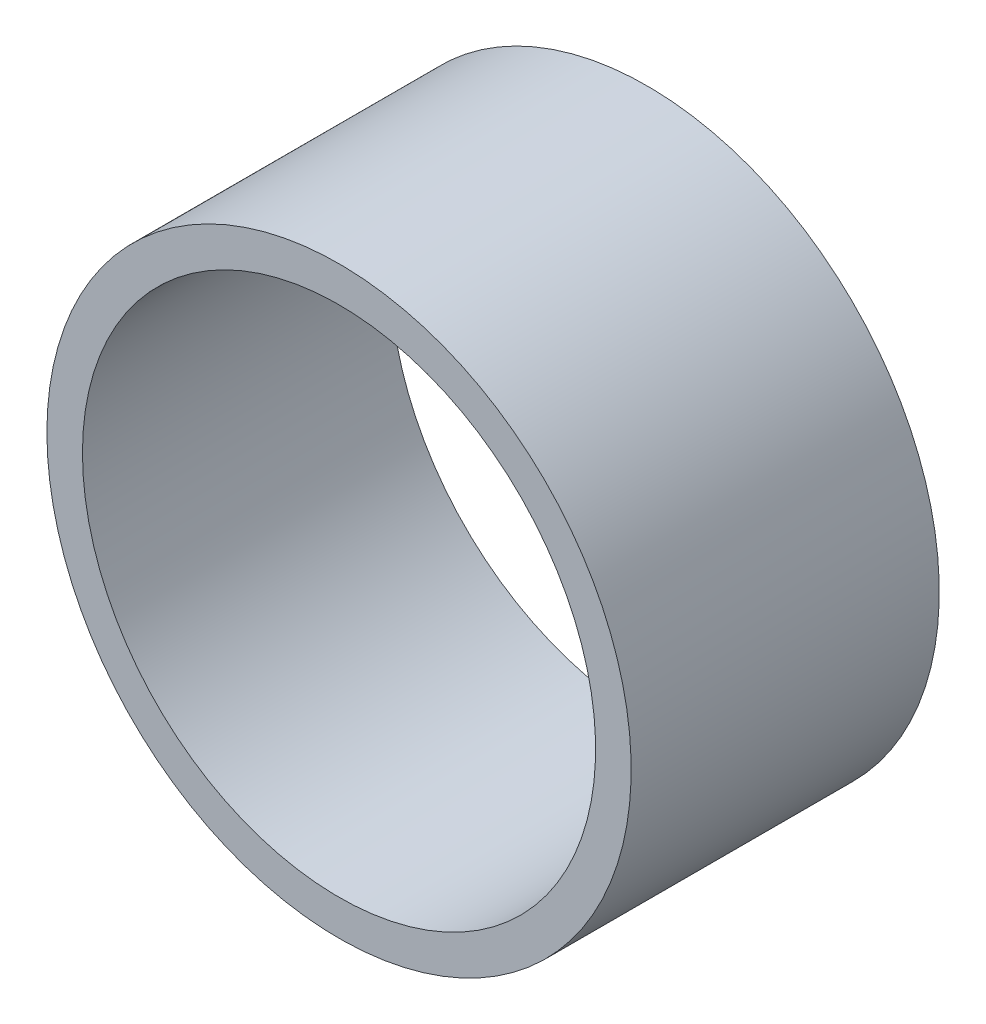
ISO-10303-21;
HEADER;
FILE_DESCRIPTION(('STEP AP214'),'2;1');
FILE_NAME('part.step','',(''),(''),'','','');
FILE_SCHEMA(('AUTOMOTIVE_DESIGN { 1 0 10303 214 1 1 1 1 }'));
ENDSEC;
DATA;
#1=APPLICATION_CONTEXT('core data for automotive mechanical design processes');
#2=APPLICATION_PROTOCOL_DEFINITION('international standard','automotive_design',2000,#1);
#3=PRODUCT_CONTEXT('',#1,'mechanical');
#4=PRODUCT('Part','Part','',(#3));
#5=PRODUCT_RELATED_PRODUCT_CATEGORY('part','',(#4));
#6=PRODUCT_DEFINITION_FORMATION('','',#4);
#7=PRODUCT_DEFINITION_CONTEXT('part definition',#1,'design');
#8=PRODUCT_DEFINITION('design','',#6,#7);
#9=PRODUCT_DEFINITION_SHAPE('','',#8);
#10=(LENGTH_UNIT() NAMED_UNIT(*) SI_UNIT(.MILLI.,.METRE.));
#11=(NAMED_UNIT(*) PLANE_ANGLE_UNIT() SI_UNIT($,.RADIAN.));
#12=(NAMED_UNIT(*) SI_UNIT($,.STERADIAN.) SOLID_ANGLE_UNIT());
#13=UNCERTAINTY_MEASURE_WITH_UNIT(LENGTH_MEASURE(1.E-05),#10,'distance_accuracy_value','');
#14=(GEOMETRIC_REPRESENTATION_CONTEXT(3) GLOBAL_UNCERTAINTY_ASSIGNED_CONTEXT((#13)) GLOBAL_UNIT_ASSIGNED_CONTEXT((#10,
#11,#12)) REPRESENTATION_CONTEXT('',''));
#15=CARTESIAN_POINT('',(0.,0.,0.));
#16=DIRECTION('',(0.,0.,1.));
#17=DIRECTION('',(1.,0.,0.));
#18=AXIS2_PLACEMENT_3D('',#15,#16,#17);
#19=CARTESIAN_POINT('',(0.,0.,6.604));
#20=DIRECTION('',(0.,0.,1.));
#21=DIRECTION('',(1.,0.,0.));
#22=AXIS2_PLACEMENT_3D('',#19,#20,#21);
#23=PLANE('',#22);
#24=CARTESIAN_POINT('',(0.,0.,6.604));
#25=DIRECTION('',(0.,0.,1.));
#26=DIRECTION('',(1.,0.,0.));
#27=AXIS2_PLACEMENT_3D('',#24,#25,#26);
#28=CIRCLE('',#27,6.262000049);
#29=CARTESIAN_POINT('',(-6.262000049,0.,6.604));
#30=VERTEX_POINT('',#29);
#31=EDGE_CURVE('E10',#30,#30,#28,.T.);
#32=ORIENTED_EDGE('',*,*,#31,.T.);
#33=EDGE_LOOP('',(#32));
#34=FACE_BOUND('',#33,.T.);
#35=CARTESIAN_POINT('',(0.,0.,6.604));
#36=DIRECTION('',(0.,0.,1.));
#37=DIRECTION('',(1.,0.,0.));
#38=AXIS2_PLACEMENT_3D('',#35,#36,#37);
#39=CIRCLE('',#38,5.5);
#40=CARTESIAN_POINT('',(-5.5,0.,6.604));
#41=VERTEX_POINT('',#40);
#42=EDGE_CURVE('E51',#41,#41,#39,.T.);
#43=ORIENTED_EDGE('',*,*,#42,.F.);
#44=EDGE_LOOP('',(#43));
#45=FACE_BOUND('',#44,.T.);
#46=ADVANCED_FACE('F40',(#34,#45),#23,.T.);
#47=CARTESIAN_POINT('',(0.,0.,0.));
#48=DIRECTION('',(0.,0.,1.));
#49=DIRECTION('',(1.,0.,0.));
#50=AXIS2_PLACEMENT_3D('',#47,#48,#49);
#51=PLANE('',#50);
#52=CARTESIAN_POINT('',(0.,0.,0.));
#53=DIRECTION('',(0.,0.,1.));
#54=DIRECTION('',(1.,0.,0.));
#55=AXIS2_PLACEMENT_3D('',#52,#53,#54);
#56=CIRCLE('',#55,6.262000049);
#57=CARTESIAN_POINT('',(-6.262000049,0.,0.));
#58=VERTEX_POINT('',#57);
#59=EDGE_CURVE('E44',#58,#58,#56,.T.);
#60=ORIENTED_EDGE('',*,*,#59,.F.);
#61=EDGE_LOOP('',(#60));
#62=FACE_BOUND('',#61,.T.);
#63=CARTESIAN_POINT('',(0.,0.,0.));
#64=DIRECTION('',(0.,0.,1.));
#65=DIRECTION('',(1.,0.,0.));
#66=AXIS2_PLACEMENT_3D('',#63,#64,#65);
#67=CIRCLE('',#66,5.5);
#68=CARTESIAN_POINT('',(-5.5,0.,0.));
#69=VERTEX_POINT('',#68);
#70=EDGE_CURVE('E53',#69,#69,#67,.T.);
#71=ORIENTED_EDGE('',*,*,#70,.T.);
#72=EDGE_LOOP('',(#71));
#73=FACE_BOUND('',#72,.T.);
#74=ADVANCED_FACE('F63',(#62,#73),#51,.F.);
#75=CARTESIAN_POINT('',(0.,0.,6.604));
#76=DIRECTION('',(0.,0.,-1.));
#77=DIRECTION('',(-1.,0.,0.));
#78=AXIS2_PLACEMENT_3D('',#75,#76,#77);
#79=CYLINDRICAL_SURFACE('',#78,6.262000049);
#80=CARTESIAN_POINT('',(-6.262000049,0.,6.604));
#81=CARTESIAN_POINT('',(-6.262000049,0.,6.53520833333333));
#82=CARTESIAN_POINT('',(-6.262000049,0.,6.46641666666667));
#83=CARTESIAN_POINT('',(-6.262000049,0.,6.32883333333333));
#84=CARTESIAN_POINT('',(-6.262000049,0.,6.26004166666667));
#85=CARTESIAN_POINT('',(-6.262000049,0.,6.12245833333333));
#86=CARTESIAN_POINT('',(-6.262000049,0.,6.05366666666667));
#87=CARTESIAN_POINT('',(-6.262000049,0.,5.91608333333333));
#88=CARTESIAN_POINT('',(-6.262000049,0.,5.84729166666667));
#89=CARTESIAN_POINT('',(-6.262000049,0.,5.70970833333333));
#90=CARTESIAN_POINT('',(-6.262000049,0.,5.64091666666667));
#91=CARTESIAN_POINT('',(-6.262000049,0.,5.50333333333333));
#92=CARTESIAN_POINT('',(-6.262000049,0.,5.43454166666667));
#93=CARTESIAN_POINT('',(-6.262000049,0.,5.29695833333333));
#94=CARTESIAN_POINT('',(-6.262000049,0.,5.22816666666667));
#95=CARTESIAN_POINT('',(-6.262000049,0.,5.09058333333333));
#96=CARTESIAN_POINT('',(-6.262000049,0.,5.02179166666667));
#97=CARTESIAN_POINT('',(-6.262000049,0.,4.88420833333333));
#98=CARTESIAN_POINT('',(-6.262000049,0.,4.81541666666667));
#99=CARTESIAN_POINT('',(-6.262000049,0.,4.67783333333333));
#100=CARTESIAN_POINT('',(-6.262000049,0.,4.60904166666667));
#101=CARTESIAN_POINT('',(-6.262000049,0.,4.47145833333333));
#102=CARTESIAN_POINT('',(-6.262000049,0.,4.40266666666667));
#103=CARTESIAN_POINT('',(-6.262000049,0.,4.26508333333333));
#104=CARTESIAN_POINT('',(-6.262000049,0.,4.19629166666667));
#105=CARTESIAN_POINT('',(-6.262000049,0.,4.05870833333333));
#106=CARTESIAN_POINT('',(-6.262000049,0.,3.98991666666667));
#107=CARTESIAN_POINT('',(-6.262000049,0.,3.85233333333333));
#108=CARTESIAN_POINT('',(-6.262000049,0.,3.78354166666667));
#109=CARTESIAN_POINT('',(-6.262000049,0.,3.64595833333333));
#110=CARTESIAN_POINT('',(-6.262000049,0.,3.57716666666667));
#111=CARTESIAN_POINT('',(-6.262000049,0.,3.43958333333333));
#112=CARTESIAN_POINT('',(-6.262000049,0.,3.37079166666667));
#113=CARTESIAN_POINT('',(-6.262000049,0.,3.23320833333333));
#114=CARTESIAN_POINT('',(-6.262000049,0.,3.16441666666667));
#115=CARTESIAN_POINT('',(-6.262000049,0.,3.02683333333333));
#116=CARTESIAN_POINT('',(-6.262000049,0.,2.95804166666667));
#117=CARTESIAN_POINT('',(-6.262000049,0.,2.82045833333333));
#118=CARTESIAN_POINT('',(-6.262000049,0.,2.75166666666667));
#119=CARTESIAN_POINT('',(-6.262000049,0.,2.61408333333333));
#120=CARTESIAN_POINT('',(-6.262000049,0.,2.54529166666667));
#121=CARTESIAN_POINT('',(-6.262000049,0.,2.40770833333333));
#122=CARTESIAN_POINT('',(-6.262000049,0.,2.33891666666667));
#123=CARTESIAN_POINT('',(-6.262000049,0.,2.20133333333333));
#124=CARTESIAN_POINT('',(-6.262000049,0.,2.13254166666667));
#125=CARTESIAN_POINT('',(-6.262000049,0.,1.99495833333333));
#126=CARTESIAN_POINT('',(-6.262000049,0.,1.92616666666667));
#127=CARTESIAN_POINT('',(-6.262000049,0.,1.78858333333333));
#128=CARTESIAN_POINT('',(-6.262000049,0.,1.71979166666667));
#129=CARTESIAN_POINT('',(-6.262000049,0.,1.58220833333333));
#130=CARTESIAN_POINT('',(-6.262000049,0.,1.51341666666667));
#131=CARTESIAN_POINT('',(-6.262000049,0.,1.37583333333333));
#132=CARTESIAN_POINT('',(-6.262000049,0.,1.30704166666667));
#133=CARTESIAN_POINT('',(-6.262000049,0.,1.16945833333333));
#134=CARTESIAN_POINT('',(-6.262000049,0.,1.10066666666667));
#135=CARTESIAN_POINT('',(-6.262000049,0.,0.963083333333333));
#136=CARTESIAN_POINT('',(-6.262000049,0.,0.894291666666666));
#137=CARTESIAN_POINT('',(-6.262000049,0.,0.756708333333333));
#138=CARTESIAN_POINT('',(-6.262000049,0.,0.687916666666667));
#139=CARTESIAN_POINT('',(-6.262000049,0.,0.550333333333333));
#140=CARTESIAN_POINT('',(-6.262000049,0.,0.481541666666667));
#141=CARTESIAN_POINT('',(-6.262000049,0.,0.343958333333333));
#142=CARTESIAN_POINT('',(-6.262000049,0.,0.275166666666667));
#143=CARTESIAN_POINT('',(-6.262000049,0.,0.137583333333333));
#144=CARTESIAN_POINT('',(-6.262000049,0.,0.0687916666666666));
#145=CARTESIAN_POINT('',(-6.262000049,0.,0.));
#146=B_SPLINE_CURVE_WITH_KNOTS('',3,(#80,#81,#82,#83,#84,#85,#86,#87,#88,#89,#90,#91,#92,#93,
#94,#95,#96,#97,#98,#99,#100,#101,#102,#103,#104,#105,#106,#107,#108,#109,#110,#111,#112,#113,
#114,#115,#116,#117,#118,#119,#120,#121,#122,#123,#124,#125,#126,#127,#128,#129,#130,#131,#132,
#133,#134,#135,#136,#137,#138,#139,#140,#141,#142,#143,#144,#145),.UNSPECIFIED.,.F.,.F.,(4,2,2,
2,2,2,2,2,2,2,2,2,2,2,2,2,2,2,2,2,2,2,2,2,2,2,2,2,2,2,2,2,4),(0.,0.206375000000001,
0.412750000000001,0.619125000000001,0.825500000000001,1.031875,1.23825,1.444625,1.651,1.857375,
2.06375,2.270125,2.4765,2.682875,2.88925,3.095625,3.302,3.508375,3.71475,3.921125,4.1275,
4.333875,4.54025,4.746625,4.953,5.159375,5.36575,5.572125,5.7785,5.984875,6.19125,6.397625,
6.604),.UNSPECIFIED.);
#147=EDGE_CURVE('BSEAM42',#30,#58,#146,.T.);
#148=ORIENTED_EDGE('',*,*,#31,.F.);
#149=ORIENTED_EDGE('',*,*,#59,.T.);
#150=ORIENTED_EDGE('',*,*,#147,.T.);
#151=ORIENTED_EDGE('',*,*,#147,.F.);
#152=EDGE_LOOP('',(#148,#150,#149,#151));
#153=FACE_BOUND('',#152,.T.);
#154=ADVANCED_FACE('F42',(#153),#79,.T.);
#155=CARTESIAN_POINT('',(0.,0.,6.604));
#156=DIRECTION('',(0.,0.,-1.));
#157=DIRECTION('',(-1.,0.,0.));
#158=AXIS2_PLACEMENT_3D('',#155,#156,#157);
#159=CYLINDRICAL_SURFACE('',#158,5.5);
#160=CARTESIAN_POINT('',(-5.5,0.,6.604));
#161=CARTESIAN_POINT('',(-5.5,0.,6.53520833333333));
#162=CARTESIAN_POINT('',(-5.5,0.,6.46641666666667));
#163=CARTESIAN_POINT('',(-5.5,0.,6.32883333333333));
#164=CARTESIAN_POINT('',(-5.5,0.,6.26004166666667));
#165=CARTESIAN_POINT('',(-5.5,0.,6.12245833333333));
#166=CARTESIAN_POINT('',(-5.5,0.,6.05366666666667));
#167=CARTESIAN_POINT('',(-5.5,0.,5.91608333333333));
#168=CARTESIAN_POINT('',(-5.5,0.,5.84729166666667));
#169=CARTESIAN_POINT('',(-5.5,0.,5.70970833333333));
#170=CARTESIAN_POINT('',(-5.5,0.,5.64091666666667));
#171=CARTESIAN_POINT('',(-5.5,0.,5.50333333333333));
#172=CARTESIAN_POINT('',(-5.5,0.,5.43454166666667));
#173=CARTESIAN_POINT('',(-5.5,0.,5.29695833333333));
#174=CARTESIAN_POINT('',(-5.5,0.,5.22816666666667));
#175=CARTESIAN_POINT('',(-5.5,0.,5.09058333333333));
#176=CARTESIAN_POINT('',(-5.5,0.,5.02179166666667));
#177=CARTESIAN_POINT('',(-5.5,0.,4.88420833333333));
#178=CARTESIAN_POINT('',(-5.5,0.,4.81541666666667));
#179=CARTESIAN_POINT('',(-5.5,0.,4.67783333333333));
#180=CARTESIAN_POINT('',(-5.5,0.,4.60904166666667));
#181=CARTESIAN_POINT('',(-5.5,0.,4.47145833333333));
#182=CARTESIAN_POINT('',(-5.5,0.,4.40266666666667));
#183=CARTESIAN_POINT('',(-5.5,0.,4.26508333333333));
#184=CARTESIAN_POINT('',(-5.5,0.,4.19629166666667));
#185=CARTESIAN_POINT('',(-5.5,0.,4.05870833333333));
#186=CARTESIAN_POINT('',(-5.5,0.,3.98991666666667));
#187=CARTESIAN_POINT('',(-5.5,0.,3.85233333333333));
#188=CARTESIAN_POINT('',(-5.5,0.,3.78354166666667));
#189=CARTESIAN_POINT('',(-5.5,0.,3.64595833333333));
#190=CARTESIAN_POINT('',(-5.5,0.,3.57716666666667));
#191=CARTESIAN_POINT('',(-5.5,0.,3.43958333333333));
#192=CARTESIAN_POINT('',(-5.5,0.,3.37079166666667));
#193=CARTESIAN_POINT('',(-5.5,0.,3.23320833333333));
#194=CARTESIAN_POINT('',(-5.5,0.,3.16441666666667));
#195=CARTESIAN_POINT('',(-5.5,0.,3.02683333333333));
#196=CARTESIAN_POINT('',(-5.5,0.,2.95804166666667));
#197=CARTESIAN_POINT('',(-5.5,0.,2.82045833333333));
#198=CARTESIAN_POINT('',(-5.5,0.,2.75166666666667));
#199=CARTESIAN_POINT('',(-5.5,0.,2.61408333333333));
#200=CARTESIAN_POINT('',(-5.5,0.,2.54529166666667));
#201=CARTESIAN_POINT('',(-5.5,0.,2.40770833333333));
#202=CARTESIAN_POINT('',(-5.5,0.,2.33891666666667));
#203=CARTESIAN_POINT('',(-5.5,0.,2.20133333333333));
#204=CARTESIAN_POINT('',(-5.5,0.,2.13254166666667));
#205=CARTESIAN_POINT('',(-5.5,0.,1.99495833333333));
#206=CARTESIAN_POINT('',(-5.5,0.,1.92616666666667));
#207=CARTESIAN_POINT('',(-5.5,0.,1.78858333333333));
#208=CARTESIAN_POINT('',(-5.5,0.,1.71979166666667));
#209=CARTESIAN_POINT('',(-5.5,0.,1.58220833333333));
#210=CARTESIAN_POINT('',(-5.5,0.,1.51341666666667));
#211=CARTESIAN_POINT('',(-5.5,0.,1.37583333333333));
#212=CARTESIAN_POINT('',(-5.5,0.,1.30704166666667));
#213=CARTESIAN_POINT('',(-5.5,0.,1.16945833333333));
#214=CARTESIAN_POINT('',(-5.5,0.,1.10066666666667));
#215=CARTESIAN_POINT('',(-5.5,0.,0.963083333333333));
#216=CARTESIAN_POINT('',(-5.5,0.,0.894291666666666));
#217=CARTESIAN_POINT('',(-5.5,0.,0.756708333333333));
#218=CARTESIAN_POINT('',(-5.5,0.,0.687916666666667));
#219=CARTESIAN_POINT('',(-5.5,0.,0.550333333333333));
#220=CARTESIAN_POINT('',(-5.5,0.,0.481541666666667));
#221=CARTESIAN_POINT('',(-5.5,0.,0.343958333333333));
#222=CARTESIAN_POINT('',(-5.5,0.,0.275166666666667));
#223=CARTESIAN_POINT('',(-5.5,0.,0.137583333333333));
#224=CARTESIAN_POINT('',(-5.5,0.,0.0687916666666666));
#225=CARTESIAN_POINT('',(-5.5,0.,0.));
#226=B_SPLINE_CURVE_WITH_KNOTS('',3,(#160,#161,#162,#163,#164,#165,#166,#167,#168,#169,#170,
#171,#172,#173,#174,#175,#176,#177,#178,#179,#180,#181,#182,#183,#184,#185,#186,#187,#188,#189,
#190,#191,#192,#193,#194,#195,#196,#197,#198,#199,#200,#201,#202,#203,#204,#205,#206,#207,#208,
#209,#210,#211,#212,#213,#214,#215,#216,#217,#218,#219,#220,#221,#222,#223,#224,#225),
.UNSPECIFIED.,.F.,.F.,(4,2,2,2,2,2,2,2,2,2,2,2,2,2,2,2,2,2,2,2,2,2,2,2,2,2,2,2,2,2,2,2,4),(0.,
0.206375,0.41275,0.619125,0.8255,1.031875,1.23825,1.444625,1.651,1.857375,2.06375,2.270125,
2.4765,2.682875,2.88925,3.095625,3.302,3.508375,3.71475,3.921125,4.1275,4.333875,4.54025,
4.746625,4.953,5.159375,5.36575,5.572125,5.7785,5.984875,6.19125,6.397625,6.604),.UNSPECIFIED.);
#227=EDGE_CURVE('BSEAM59',#41,#69,#226,.T.);
#228=ORIENTED_EDGE('',*,*,#42,.T.);
#229=ORIENTED_EDGE('',*,*,#70,.F.);
#230=ORIENTED_EDGE('',*,*,#227,.T.);
#231=ORIENTED_EDGE('',*,*,#227,.F.);
#232=EDGE_LOOP('',(#228,#230,#229,#231));
#233=FACE_BOUND('',#232,.T.);
#234=ADVANCED_FACE('F59',(#233),#159,.F.);
#235=CLOSED_SHELL('',(#46,#74,#154,#234));
#236=MANIFOLD_SOLID_BREP('B2',#235);
#237=ADVANCED_BREP_SHAPE_REPRESENTATION('',(#18,#236),#14);
#238=SHAPE_DEFINITION_REPRESENTATION(#9,#237);
ENDSEC;
END-ISO-10303-21;
